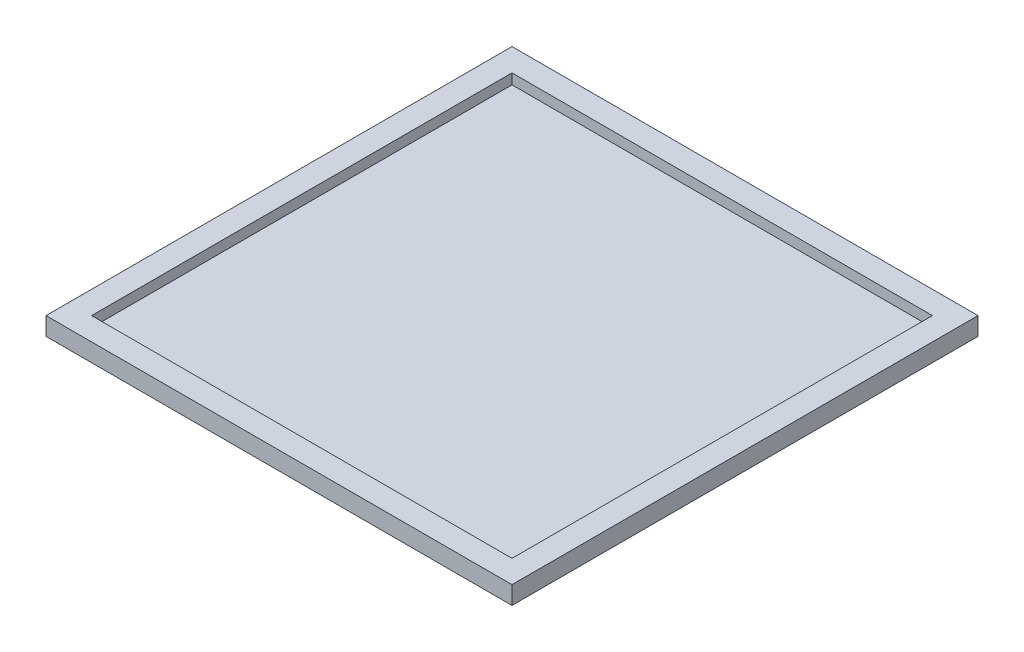
ISO-10303-21;
HEADER;
FILE_DESCRIPTION(('STEP AP214'),'2;1');
FILE_NAME('part.step','',(''),(''),'','','');
FILE_SCHEMA(('AUTOMOTIVE_DESIGN { 1 0 10303 214 1 1 1 1 }'));
ENDSEC;
DATA;
#1=APPLICATION_CONTEXT('core data for automotive mechanical design processes');
#2=APPLICATION_PROTOCOL_DEFINITION('international standard','automotive_design',2000,#1);
#3=PRODUCT_CONTEXT('',#1,'mechanical');
#4=PRODUCT('Part','Part','',(#3));
#5=PRODUCT_RELATED_PRODUCT_CATEGORY('part','',(#4));
#6=PRODUCT_DEFINITION_FORMATION('','',#4);
#7=PRODUCT_DEFINITION_CONTEXT('part definition',#1,'design');
#8=PRODUCT_DEFINITION('design','',#6,#7);
#9=PRODUCT_DEFINITION_SHAPE('','',#8);
#10=(LENGTH_UNIT() NAMED_UNIT(*) SI_UNIT(.MILLI.,.METRE.));
#11=(NAMED_UNIT(*) PLANE_ANGLE_UNIT() SI_UNIT($,.RADIAN.));
#12=(NAMED_UNIT(*) SI_UNIT($,.STERADIAN.) SOLID_ANGLE_UNIT());
#13=UNCERTAINTY_MEASURE_WITH_UNIT(LENGTH_MEASURE(1.E-05),#10,'distance_accuracy_value','');
#14=(GEOMETRIC_REPRESENTATION_CONTEXT(3) GLOBAL_UNCERTAINTY_ASSIGNED_CONTEXT((#13)) GLOBAL_UNIT_ASSIGNED_CONTEXT((#10,
#11,#12)) REPRESENTATION_CONTEXT('',''));
#15=CARTESIAN_POINT('',(0.,0.,0.));
#16=DIRECTION('',(0.,0.,1.));
#17=DIRECTION('',(1.,0.,0.));
#18=AXIS2_PLACEMENT_3D('',#15,#16,#17);
#19=CARTESIAN_POINT('',(-325.610898826673,31.7,447.943808122281));
#20=DIRECTION('',(0.,0.,-1.));
#21=DIRECTION('',(-1.,0.,0.));
#22=AXIS2_PLACEMENT_3D('',#19,#20,#21);
#23=PLANE('',#22);
#24=DIRECTION('',(1.,0.,0.));
#25=VECTOR('',#24,1.);
#26=CARTESIAN_POINT('',(-325.610898826673,0.,447.943808122281));
#27=LINE('',#26,#25);
#28=CARTESIAN_POINT('',(-325.610898826673,0.,447.943808122281));
#29=VERTEX_POINT('',#28);
#30=CARTESIAN_POINT('',(494.389101173327,0.,447.943808122281));
#31=VERTEX_POINT('',#30);
#32=EDGE_CURVE('E162',#29,#31,#27,.T.);
#33=ORIENTED_EDGE('',*,*,#32,.T.);
#34=DIRECTION('',(0.,-1.,0.));
#35=VECTOR('',#34,1.);
#36=CARTESIAN_POINT('',(494.389101173327,31.7,447.943808122281));
#37=LINE('',#36,#35);
#38=CARTESIAN_POINT('',(494.389101173327,31.7,447.943808122281));
#39=VERTEX_POINT('',#38);
#40=EDGE_CURVE('E11',#39,#31,#37,.T.);
#41=ORIENTED_EDGE('',*,*,#40,.F.);
#42=DIRECTION('',(1.,0.,0.));
#43=VECTOR('',#42,1.);
#44=CARTESIAN_POINT('',(-325.610898826673,31.7,447.943808122281));
#45=LINE('',#44,#43);
#46=CARTESIAN_POINT('',(-325.610898826673,31.7,447.943808122281));
#47=VERTEX_POINT('',#46);
#48=EDGE_CURVE('E94',#47,#39,#45,.T.);
#49=ORIENTED_EDGE('',*,*,#48,.F.);
#50=DIRECTION('',(0.,-1.,0.));
#51=VECTOR('',#50,1.);
#52=CARTESIAN_POINT('',(-325.610898826673,31.7,447.943808122281));
#53=LINE('',#52,#51);
#54=EDGE_CURVE('E182',#47,#29,#53,.T.);
#55=ORIENTED_EDGE('',*,*,#54,.T.);
#56=EDGE_LOOP('',(#33,#41,#49,#55));
#57=FACE_BOUND('',#56,.T.);
#58=ADVANCED_FACE('F44',(#57),#23,.F.);
#59=CARTESIAN_POINT('',(494.389101173326,31.7,-372.056191877719));
#60=DIRECTION('',(1.,0.,0.));
#61=DIRECTION('',(0.,0.,-1.));
#62=AXIS2_PLACEMENT_3D('',#59,#60,#61);
#63=PLANE('',#62);
#64=DIRECTION('',(0.,0.,1.));
#65=VECTOR('',#64,1.);
#66=CARTESIAN_POINT('',(494.389101173326,0.,-372.056191877719));
#67=LINE('',#66,#65);
#68=CARTESIAN_POINT('',(494.389101173326,0.,-372.056191877719));
#69=VERTEX_POINT('',#68);
#70=EDGE_CURVE('E183',#69,#31,#67,.T.);
#71=ORIENTED_EDGE('',*,*,#70,.F.);
#72=DIRECTION('',(0.,-1.,0.));
#73=VECTOR('',#72,1.);
#74=CARTESIAN_POINT('',(494.389101173326,31.7,-372.056191877719));
#75=LINE('',#74,#73);
#76=CARTESIAN_POINT('',(494.389101173326,31.7,-372.056191877719));
#77=VERTEX_POINT('',#76);
#78=EDGE_CURVE('E52',#77,#69,#75,.T.);
#79=ORIENTED_EDGE('',*,*,#78,.F.);
#80=DIRECTION('',(0.,0.,1.));
#81=VECTOR('',#80,1.);
#82=CARTESIAN_POINT('',(494.389101173326,31.7,-372.056191877719));
#83=LINE('',#82,#81);
#84=EDGE_CURVE('E174',#77,#39,#83,.T.);
#85=ORIENTED_EDGE('',*,*,#84,.T.);
#86=ORIENTED_EDGE('',*,*,#40,.T.);
#87=EDGE_LOOP('',(#71,#79,#85,#86));
#88=FACE_BOUND('',#87,.T.);
#89=ADVANCED_FACE('F202',(#88),#63,.T.);
#90=CARTESIAN_POINT('',(-325.610898826673,31.7,-372.056191877719));
#91=DIRECTION('',(0.,0.,-1.));
#92=DIRECTION('',(-1.,0.,0.));
#93=AXIS2_PLACEMENT_3D('',#90,#91,#92);
#94=PLANE('',#93);
#95=DIRECTION('',(1.,0.,0.));
#96=VECTOR('',#95,1.);
#97=CARTESIAN_POINT('',(-325.610898826673,0.,-372.056191877719));
#98=LINE('',#97,#96);
#99=CARTESIAN_POINT('',(-325.610898826673,0.,-372.056191877719));
#100=VERTEX_POINT('',#99);
#101=EDGE_CURVE('E188',#100,#69,#98,.T.);
#102=ORIENTED_EDGE('',*,*,#101,.F.);
#103=DIRECTION('',(0.,-1.,0.));
#104=VECTOR('',#103,1.);
#105=CARTESIAN_POINT('',(-325.610898826673,31.7,-372.056191877719));
#106=LINE('',#105,#104);
#107=CARTESIAN_POINT('',(-325.610898826673,31.7,-372.056191877719));
#108=VERTEX_POINT('',#107);
#109=EDGE_CURVE('E197',#108,#100,#106,.T.);
#110=ORIENTED_EDGE('',*,*,#109,.F.);
#111=DIRECTION('',(1.,0.,0.));
#112=VECTOR('',#111,1.);
#113=CARTESIAN_POINT('',(-325.610898826673,31.7,-372.056191877719));
#114=LINE('',#113,#112);
#115=EDGE_CURVE('E172',#108,#77,#114,.T.);
#116=ORIENTED_EDGE('',*,*,#115,.T.);
#117=ORIENTED_EDGE('',*,*,#78,.T.);
#118=EDGE_LOOP('',(#102,#110,#116,#117));
#119=FACE_BOUND('',#118,.T.);
#120=ADVANCED_FACE('F201',(#119),#94,.T.);
#121=CARTESIAN_POINT('',(-325.610898826673,31.7,-372.056191877719));
#122=DIRECTION('',(1.,0.,0.));
#123=DIRECTION('',(0.,0.,-1.));
#124=AXIS2_PLACEMENT_3D('',#121,#122,#123);
#125=PLANE('',#124);
#126=DIRECTION('',(0.,0.,1.));
#127=VECTOR('',#126,1.);
#128=CARTESIAN_POINT('',(-325.610898826673,0.,-372.056191877719));
#129=LINE('',#128,#127);
#130=EDGE_CURVE('E90',#100,#29,#129,.T.);
#131=ORIENTED_EDGE('',*,*,#130,.T.);
#132=ORIENTED_EDGE('',*,*,#54,.F.);
#133=DIRECTION('',(0.,0.,1.));
#134=VECTOR('',#133,1.);
#135=CARTESIAN_POINT('',(-325.610898826673,31.7,-372.056191877719));
#136=LINE('',#135,#134);
#137=EDGE_CURVE('E68',#108,#47,#136,.T.);
#138=ORIENTED_EDGE('',*,*,#137,.F.);
#139=ORIENTED_EDGE('',*,*,#109,.T.);
#140=EDGE_LOOP('',(#131,#132,#138,#139));
#141=FACE_BOUND('',#140,.T.);
#142=ADVANCED_FACE('F209',(#141),#125,.F.);
#143=CARTESIAN_POINT('',(0.,31.7,0.));
#144=DIRECTION('',(0.,-1.,0.));
#145=DIRECTION('',(0.,0.,-1.));
#146=AXIS2_PLACEMENT_3D('',#143,#144,#145);
#147=PLANE('',#146);
#148=DIRECTION('',(0.,0.,1.));
#149=VECTOR('',#148,1.);
#150=CARTESIAN_POINT('',(454.289101173326,31.7,-331.956191877719));
#151=LINE('',#150,#149);
#152=CARTESIAN_POINT('',(454.289101173326,31.7,-331.956191877719));
#153=VERTEX_POINT('',#152);
#154=CARTESIAN_POINT('',(454.289101173327,31.7,407.843808122281));
#155=VERTEX_POINT('',#154);
#156=EDGE_CURVE('E152',#153,#155,#151,.T.);
#157=ORIENTED_EDGE('',*,*,#156,.T.);
#158=DIRECTION('',(1.,0.,0.));
#159=VECTOR('',#158,1.);
#160=CARTESIAN_POINT('',(-285.510898826673,31.7,407.843808122281));
#161=LINE('',#160,#159);
#162=CARTESIAN_POINT('',(-285.510898826673,31.7,407.843808122281));
#163=VERTEX_POINT('',#162);
#164=EDGE_CURVE('E58',#163,#155,#161,.T.);
#165=ORIENTED_EDGE('',*,*,#164,.F.);
#166=DIRECTION('',(0.,0.,1.));
#167=VECTOR('',#166,1.);
#168=CARTESIAN_POINT('',(-285.510898826673,31.7,-331.956191877719));
#169=LINE('',#168,#167);
#170=CARTESIAN_POINT('',(-285.510898826673,31.7,-331.956191877719));
#171=VERTEX_POINT('',#170);
#172=EDGE_CURVE('E143',#171,#163,#169,.T.);
#173=ORIENTED_EDGE('',*,*,#172,.F.);
#174=DIRECTION('',(1.,0.,0.));
#175=VECTOR('',#174,1.);
#176=CARTESIAN_POINT('',(-285.510898826673,31.7,-331.956191877719));
#177=LINE('',#176,#175);
#178=EDGE_CURVE('E144',#171,#153,#177,.T.);
#179=ORIENTED_EDGE('',*,*,#178,.T.);
#180=EDGE_LOOP('',(#157,#165,#173,#179));
#181=FACE_BOUND('',#180,.T.);
#182=ORIENTED_EDGE('',*,*,#48,.T.);
#183=ORIENTED_EDGE('',*,*,#84,.F.);
#184=ORIENTED_EDGE('',*,*,#115,.F.);
#185=ORIENTED_EDGE('',*,*,#137,.T.);
#186=EDGE_LOOP('',(#182,#183,#184,#185));
#187=FACE_BOUND('',#186,.T.);
#188=ADVANCED_FACE('F211',(#181,#187),#147,.F.);
#189=CARTESIAN_POINT('',(0.,0.,0.));
#190=DIRECTION('',(0.,-1.,0.));
#191=DIRECTION('',(0.,0.,-1.));
#192=AXIS2_PLACEMENT_3D('',#189,#190,#191);
#193=PLANE('',#192);
#194=ORIENTED_EDGE('',*,*,#32,.F.);
#195=ORIENTED_EDGE('',*,*,#130,.F.);
#196=ORIENTED_EDGE('',*,*,#101,.T.);
#197=ORIENTED_EDGE('',*,*,#70,.T.);
#198=EDGE_LOOP('',(#194,#195,#196,#197));
#199=FACE_BOUND('',#198,.T.);
#200=ADVANCED_FACE('F208',(#199),#193,.T.);
#201=CARTESIAN_POINT('',(-285.510898826673,13.39,407.843808122281));
#202=DIRECTION('',(0.,0.,1.));
#203=DIRECTION('',(1.,0.,0.));
#204=AXIS2_PLACEMENT_3D('',#201,#202,#203);
#205=PLANE('',#204);
#206=ORIENTED_EDGE('',*,*,#164,.T.);
#207=DIRECTION('',(0.,1.,0.));
#208=VECTOR('',#207,1.);
#209=CARTESIAN_POINT('',(454.289101173327,13.39,407.843808122281));
#210=LINE('',#209,#208);
#211=CARTESIAN_POINT('',(454.289101173327,13.39,407.843808122281));
#212=VERTEX_POINT('',#211);
#213=EDGE_CURVE('E122',#212,#155,#210,.T.);
#214=ORIENTED_EDGE('',*,*,#213,.F.);
#215=DIRECTION('',(1.,0.,0.));
#216=VECTOR('',#215,1.);
#217=CARTESIAN_POINT('',(-285.510898826673,13.39,407.843808122281));
#218=LINE('',#217,#216);
#219=CARTESIAN_POINT('',(-285.510898826673,13.39,407.843808122281));
#220=VERTEX_POINT('',#219);
#221=EDGE_CURVE('E128',#220,#212,#218,.T.);
#222=ORIENTED_EDGE('',*,*,#221,.F.);
#223=DIRECTION('',(0.,1.,0.));
#224=VECTOR('',#223,1.);
#225=CARTESIAN_POINT('',(-285.510898826673,13.39,407.843808122281));
#226=LINE('',#225,#224);
#227=EDGE_CURVE('E159',#220,#163,#226,.T.);
#228=ORIENTED_EDGE('',*,*,#227,.T.);
#229=EDGE_LOOP('',(#206,#214,#222,#228));
#230=FACE_BOUND('',#229,.T.);
#231=ADVANCED_FACE('F135',(#230),#205,.F.);
#232=CARTESIAN_POINT('',(-285.510898826673,13.39,-331.956191877719));
#233=DIRECTION('',(-1.,0.,0.));
#234=DIRECTION('',(0.,0.,1.));
#235=AXIS2_PLACEMENT_3D('',#232,#233,#234);
#236=PLANE('',#235);
#237=ORIENTED_EDGE('',*,*,#172,.T.);
#238=ORIENTED_EDGE('',*,*,#227,.F.);
#239=DIRECTION('',(0.,0.,1.));
#240=VECTOR('',#239,1.);
#241=CARTESIAN_POINT('',(-285.510898826673,13.39,-331.956191877719));
#242=LINE('',#241,#240);
#243=CARTESIAN_POINT('',(-285.510898826673,13.39,-331.956191877719));
#244=VERTEX_POINT('',#243);
#245=EDGE_CURVE('E136',#244,#220,#242,.T.);
#246=ORIENTED_EDGE('',*,*,#245,.F.);
#247=DIRECTION('',(0.,1.,0.));
#248=VECTOR('',#247,1.);
#249=CARTESIAN_POINT('',(-285.510898826673,13.39,-331.956191877719));
#250=LINE('',#249,#248);
#251=EDGE_CURVE('E163',#244,#171,#250,.T.);
#252=ORIENTED_EDGE('',*,*,#251,.T.);
#253=EDGE_LOOP('',(#237,#238,#246,#252));
#254=FACE_BOUND('',#253,.T.);
#255=ADVANCED_FACE('F254',(#254),#236,.F.);
#256=CARTESIAN_POINT('',(-285.510898826673,13.39,-331.956191877719));
#257=DIRECTION('',(0.,0.,1.));
#258=DIRECTION('',(1.,0.,0.));
#259=AXIS2_PLACEMENT_3D('',#256,#257,#258);
#260=PLANE('',#259);
#261=ORIENTED_EDGE('',*,*,#178,.F.);
#262=ORIENTED_EDGE('',*,*,#251,.F.);
#263=DIRECTION('',(1.,0.,0.));
#264=VECTOR('',#263,1.);
#265=CARTESIAN_POINT('',(-285.510898826673,13.39,-331.956191877719));
#266=LINE('',#265,#264);
#267=CARTESIAN_POINT('',(454.289101173326,13.39,-331.956191877719));
#268=VERTEX_POINT('',#267);
#269=EDGE_CURVE('E129',#244,#268,#266,.T.);
#270=ORIENTED_EDGE('',*,*,#269,.T.);
#271=DIRECTION('',(0.,1.,0.));
#272=VECTOR('',#271,1.);
#273=CARTESIAN_POINT('',(454.289101173326,13.39,-331.956191877719));
#274=LINE('',#273,#272);
#275=EDGE_CURVE('E123',#268,#153,#274,.T.);
#276=ORIENTED_EDGE('',*,*,#275,.T.);
#277=EDGE_LOOP('',(#261,#262,#270,#276));
#278=FACE_BOUND('',#277,.T.);
#279=ADVANCED_FACE('F263',(#278),#260,.T.);
#280=CARTESIAN_POINT('',(454.289101173326,13.39,-331.956191877719));
#281=DIRECTION('',(-1.,0.,0.));
#282=DIRECTION('',(0.,0.,1.));
#283=AXIS2_PLACEMENT_3D('',#280,#281,#282);
#284=PLANE('',#283);
#285=ORIENTED_EDGE('',*,*,#156,.F.);
#286=ORIENTED_EDGE('',*,*,#275,.F.);
#287=DIRECTION('',(0.,0.,1.));
#288=VECTOR('',#287,1.);
#289=CARTESIAN_POINT('',(454.289101173326,13.39,-331.956191877719));
#290=LINE('',#289,#288);
#291=EDGE_CURVE('E118',#268,#212,#290,.T.);
#292=ORIENTED_EDGE('',*,*,#291,.T.);
#293=ORIENTED_EDGE('',*,*,#213,.T.);
#294=EDGE_LOOP('',(#285,#286,#292,#293));
#295=FACE_BOUND('',#294,.T.);
#296=ADVANCED_FACE('F121',(#295),#284,.T.);
#297=CARTESIAN_POINT('',(0.,13.39,0.));
#298=DIRECTION('',(0.,-1.,0.));
#299=DIRECTION('',(0.,0.,-1.));
#300=AXIS2_PLACEMENT_3D('',#297,#298,#299);
#301=PLANE('',#300);
#302=ORIENTED_EDGE('',*,*,#221,.T.);
#303=ORIENTED_EDGE('',*,*,#291,.F.);
#304=ORIENTED_EDGE('',*,*,#269,.F.);
#305=ORIENTED_EDGE('',*,*,#245,.T.);
#306=EDGE_LOOP('',(#302,#303,#304,#305));
#307=FACE_BOUND('',#306,.T.);
#308=ADVANCED_FACE('F139',(#307),#301,.F.);
#309=CLOSED_SHELL('',(#58,#89,#120,#142,#188,#200,#231,#255,#279,#296,#308));
#310=MANIFOLD_SOLID_BREP('B2',#309);
#311=ADVANCED_BREP_SHAPE_REPRESENTATION('',(#18,#310),#14);
#312=SHAPE_DEFINITION_REPRESENTATION(#9,#311);
ENDSEC;
END-ISO-10303-21;
